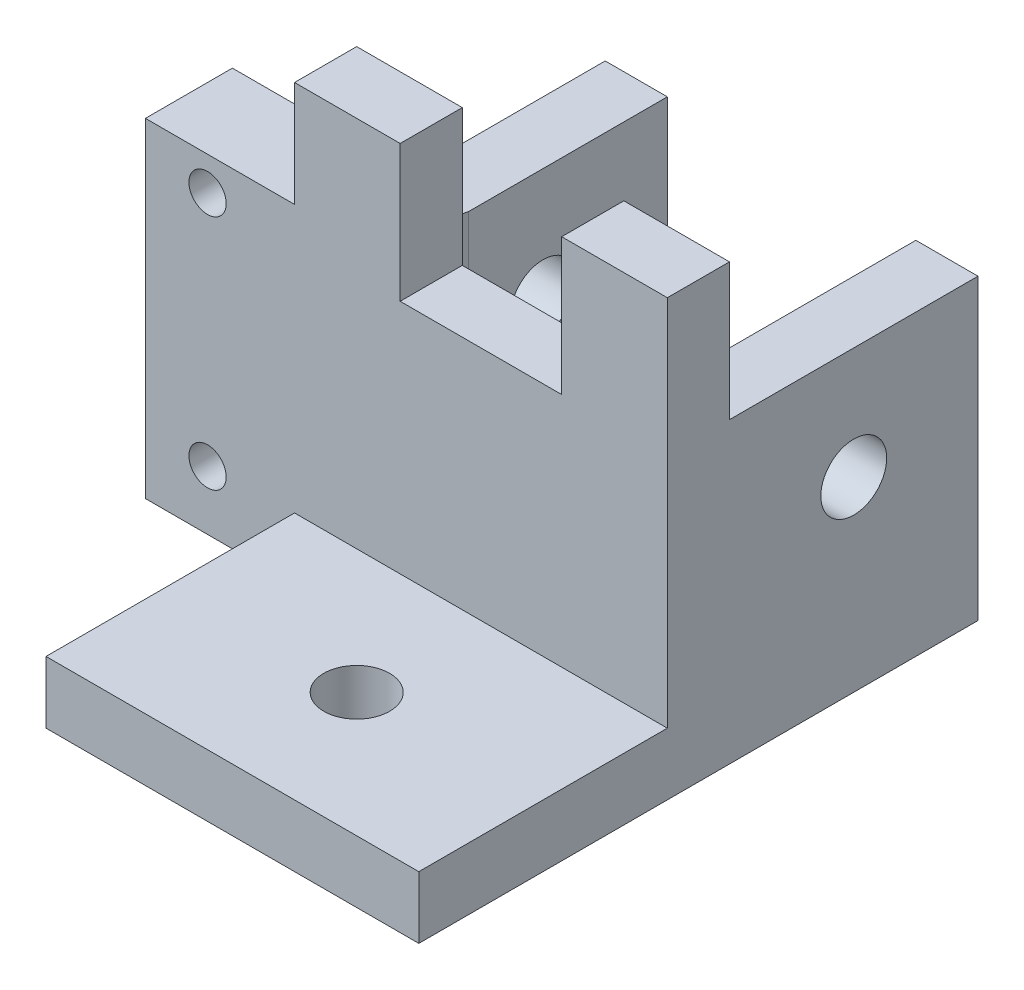
ISO-10303-21;
HEADER;
FILE_DESCRIPTION(('STEP AP214'),'2;1');
FILE_NAME('part.step','',(''),(''),'','','');
FILE_SCHEMA(('AUTOMOTIVE_DESIGN { 1 0 10303 214 1 1 1 1 }'));
ENDSEC;
DATA;
#1=APPLICATION_CONTEXT('core data for automotive mechanical design processes');
#2=APPLICATION_PROTOCOL_DEFINITION('international standard','automotive_design',2000,#1);
#3=PRODUCT_CONTEXT('',#1,'mechanical');
#4=PRODUCT('Part','Part','',(#3));
#5=PRODUCT_RELATED_PRODUCT_CATEGORY('part','',(#4));
#6=PRODUCT_DEFINITION_FORMATION('','',#4);
#7=PRODUCT_DEFINITION_CONTEXT('part definition',#1,'design');
#8=PRODUCT_DEFINITION('design','',#6,#7);
#9=PRODUCT_DEFINITION_SHAPE('','',#8);
#10=(LENGTH_UNIT() NAMED_UNIT(*) SI_UNIT(.MILLI.,.METRE.));
#11=(NAMED_UNIT(*) PLANE_ANGLE_UNIT() SI_UNIT($,.RADIAN.));
#12=(NAMED_UNIT(*) SI_UNIT($,.STERADIAN.) SOLID_ANGLE_UNIT());
#13=UNCERTAINTY_MEASURE_WITH_UNIT(LENGTH_MEASURE(1.E-05),#10,'distance_accuracy_value','');
#14=(GEOMETRIC_REPRESENTATION_CONTEXT(3) GLOBAL_UNCERTAINTY_ASSIGNED_CONTEXT((#13)) GLOBAL_UNIT_ASSIGNED_CONTEXT((#10,
#11,#12)) REPRESENTATION_CONTEXT('',''));
#15=CARTESIAN_POINT('',(0.,0.,0.));
#16=DIRECTION('',(0.,0.,1.));
#17=DIRECTION('',(1.,0.,0.));
#18=AXIS2_PLACEMENT_3D('',#15,#16,#17);
#19=CARTESIAN_POINT('',(0.,5.,0.));
#20=DIRECTION('',(1.,0.,0.));
#21=DIRECTION('',(0.,0.,-1.));
#22=AXIS2_PLACEMENT_3D('',#19,#20,#21);
#23=PLANE('',#22);
#24=CARTESIAN_POINT('',(0.,15.,-35.));
#25=DIRECTION('',(1.,0.,0.));
#26=DIRECTION('',(0.,0.,-1.));
#27=AXIS2_PLACEMENT_3D('',#24,#25,#26);
#28=CIRCLE('',#27,2.65);
#29=CARTESIAN_POINT('',(0.,15.,-37.65));
#30=VERTEX_POINT('',#29);
#31=EDGE_CURVE('E341',#30,#30,#28,.T.);
#32=ORIENTED_EDGE('',*,*,#31,.T.);
#33=EDGE_LOOP('',(#32));
#34=FACE_BOUND('',#33,.T.);
#35=DIRECTION('',(0.,-1.,0.));
#36=VECTOR('',#35,1.);
#37=CARTESIAN_POINT('',(0.,26.5,-25.));
#38=LINE('',#37,#36);
#39=CARTESIAN_POINT('',(0.,19.5,-25.));
#40=VERTEX_POINT('',#39);
#41=CARTESIAN_POINT('',(0.,9.,-25.));
#42=VERTEX_POINT('',#41);
#43=EDGE_CURVE('E294',#40,#42,#38,.T.);
#44=ORIENTED_EDGE('',*,*,#43,.F.);
#45=DIRECTION('',(0.,-0.707106781186544,0.707106781186551));
#46=VECTOR('',#45,1.);
#47=CARTESIAN_POINT('',(0.,-0.249999999999936,-5.24999999999989));
#48=LINE('',#47,#46);
#49=CARTESIAN_POINT('',(0.,21.5,-27.));
#50=VERTEX_POINT('',#49);
#51=EDGE_CURVE('E550',#40,#50,#48,.F.);
#52=ORIENTED_EDGE('',*,*,#51,.T.);
#53=DIRECTION('',(0.,-1.,0.));
#54=VECTOR('',#53,1.);
#55=CARTESIAN_POINT('',(0.,26.5,-27.));
#56=LINE('',#55,#54);
#57=CARTESIAN_POINT('',(0.,24.,-27.));
#58=VERTEX_POINT('',#57);
#59=EDGE_CURVE('E254',#58,#50,#56,.T.);
#60=ORIENTED_EDGE('',*,*,#59,.F.);
#61=DIRECTION('',(0.,0.,1.));
#62=VECTOR('',#61,1.);
#63=CARTESIAN_POINT('',(0.,24.,-25.));
#64=LINE('',#63,#62);
#65=CARTESIAN_POINT('',(0.,24.,-45.));
#66=VERTEX_POINT('',#65);
#67=EDGE_CURVE('E434',#66,#58,#64,.T.);
#68=ORIENTED_EDGE('',*,*,#67,.F.);
#69=DIRECTION('',(0.,-1.,0.));
#70=VECTOR('',#69,1.);
#71=CARTESIAN_POINT('',(0.,5.,-45.));
#72=LINE('',#71,#70);
#73=CARTESIAN_POINT('',(0.,0.,-45.));
#74=VERTEX_POINT('',#73);
#75=EDGE_CURVE('E507',#66,#74,#72,.T.);
#76=ORIENTED_EDGE('',*,*,#75,.T.);
#77=DIRECTION('',(0.,0.,1.));
#78=VECTOR('',#77,1.);
#79=CARTESIAN_POINT('',(0.,0.,0.));
#80=LINE('',#79,#78);
#81=CARTESIAN_POINT('',(0.,0.,-27.));
#82=VERTEX_POINT('',#81);
#83=EDGE_CURVE('E508',#74,#82,#80,.T.);
#84=ORIENTED_EDGE('',*,*,#83,.T.);
#85=DIRECTION('',(0.,-1.,0.));
#86=VECTOR('',#85,1.);
#87=CARTESIAN_POINT('',(0.,0.,-27.));
#88=LINE('',#87,#86);
#89=CARTESIAN_POINT('',(0.,7.,-27.));
#90=VERTEX_POINT('',#89);
#91=EDGE_CURVE('E275',#90,#82,#88,.T.);
#92=ORIENTED_EDGE('',*,*,#91,.F.);
#93=DIRECTION('',(0.,0.707106781186546,0.707106781186549));
#94=VECTOR('',#93,1.);
#95=CARTESIAN_POINT('',(0.,19.5,-14.5));
#96=LINE('',#95,#94);
#97=EDGE_CURVE('E11',#90,#42,#96,.T.);
#98=ORIENTED_EDGE('',*,*,#97,.T.);
#99=EDGE_LOOP('',(#44,#52,#60,#68,#76,#84,#92,#98));
#100=FACE_BOUND('',#99,.T.);
#101=ADVANCED_FACE('F41',(#34,#100),#23,.F.);
#102=CARTESIAN_POINT('',(0.,35.,-25.));
#103=DIRECTION('',(0.,0.,1.));
#104=DIRECTION('',(1.,0.,0.));
#105=AXIS2_PLACEMENT_3D('',#102,#103,#104);
#106=PLANE('',#105);
#107=DIRECTION('',(0.,-1.,0.));
#108=VECTOR('',#107,1.);
#109=CARTESIAN_POINT('',(0.,26.5,-25.));
#110=LINE('',#109,#108);
#111=CARTESIAN_POINT('',(0.,26.5,-25.));
#112=VERTEX_POINT('',#111);
#113=CARTESIAN_POINT('',(0.,24.,-25.));
#114=VERTEX_POINT('',#113);
#115=EDGE_CURVE('E262',#112,#114,#110,.T.);
#116=ORIENTED_EDGE('',*,*,#115,.F.);
#117=DIRECTION('',(0.,-1.,0.));
#118=VECTOR('',#117,1.);
#119=CARTESIAN_POINT('',(0.,35.,-25.));
#120=LINE('',#119,#118);
#121=CARTESIAN_POINT('',(0.,35.,-25.));
#122=VERTEX_POINT('',#121);
#123=EDGE_CURVE('E472',#122,#112,#120,.T.);
#124=ORIENTED_EDGE('',*,*,#123,.F.);
#125=DIRECTION('',(-1.,0.,0.));
#126=VECTOR('',#125,1.);
#127=CARTESIAN_POINT('',(0.,35.,-25.));
#128=LINE('',#127,#126);
#129=CARTESIAN_POINT('',(8.49999999999999,35.,-25.));
#130=VERTEX_POINT('',#129);
#131=EDGE_CURVE('E467',#130,#122,#128,.T.);
#132=ORIENTED_EDGE('',*,*,#131,.F.);
#133=DIRECTION('',(0.,1.,0.));
#134=VECTOR('',#133,1.);
#135=CARTESIAN_POINT('',(8.49999999999999,24.,-25.));
#136=LINE('',#135,#134);
#137=CARTESIAN_POINT('',(8.49999999999999,24.,-25.));
#138=VERTEX_POINT('',#137);
#139=EDGE_CURVE('E402',#138,#130,#136,.T.);
#140=ORIENTED_EDGE('',*,*,#139,.F.);
#141=DIRECTION('',(-1.,0.,0.));
#142=VECTOR('',#141,1.);
#143=CARTESIAN_POINT('',(8.49999999999999,24.,-25.));
#144=LINE('',#143,#142);
#145=CARTESIAN_POINT('',(21.5,24.,-25.));
#146=VERTEX_POINT('',#145);
#147=EDGE_CURVE('E393',#146,#138,#144,.T.);
#148=ORIENTED_EDGE('',*,*,#147,.F.);
#149=DIRECTION('',(0.,1.,0.));
#150=VECTOR('',#149,1.);
#151=CARTESIAN_POINT('',(21.5,24.,-25.));
#152=LINE('',#151,#150);
#153=CARTESIAN_POINT('',(21.5,35.,-25.));
#154=VERTEX_POINT('',#153);
#155=EDGE_CURVE('E406',#146,#154,#152,.T.);
#156=ORIENTED_EDGE('',*,*,#155,.T.);
#157=CARTESIAN_POINT('',(30.,35.,-25.));
#158=VERTEX_POINT('',#157);
#159=EDGE_CURVE('E468',#158,#154,#128,.T.);
#160=ORIENTED_EDGE('',*,*,#159,.F.);
#161=DIRECTION('',(0.,-1.,0.));
#162=VECTOR('',#161,1.);
#163=CARTESIAN_POINT('',(30.,35.,-25.));
#164=LINE('',#163,#162);
#165=CARTESIAN_POINT('',(30.,24.,-25.));
#166=VERTEX_POINT('',#165);
#167=EDGE_CURVE('E481',#158,#166,#164,.T.);
#168=ORIENTED_EDGE('',*,*,#167,.T.);
#169=DIRECTION('',(1.,0.,0.));
#170=VECTOR('',#169,1.);
#171=CARTESIAN_POINT('',(25.,24.,-25.));
#172=LINE('',#171,#170);
#173=CARTESIAN_POINT('',(26.,24.,-25.));
#174=VERTEX_POINT('',#173);
#175=EDGE_CURVE('E419',#174,#166,#172,.T.);
#176=ORIENTED_EDGE('',*,*,#175,.F.);
#177=DIRECTION('',(0.,1.,0.));
#178=VECTOR('',#177,1.);
#179=CARTESIAN_POINT('',(26.,0.876894374382341,-25.));
#180=LINE('',#179,#178);
#181=CARTESIAN_POINT('',(26.,5.,-25.));
#182=VERTEX_POINT('',#181);
#183=EDGE_CURVE('E312',#182,#174,#180,.T.);
#184=ORIENTED_EDGE('',*,*,#183,.F.);
#185=DIRECTION('',(-1.,0.,0.));
#186=VECTOR('',#185,1.);
#187=CARTESIAN_POINT('',(0.,5.,-25.));
#188=LINE('',#187,#186);
#189=CARTESIAN_POINT('',(3.99999999999999,5.,-25.));
#190=VERTEX_POINT('',#189);
#191=EDGE_CURVE('E459',#182,#190,#188,.T.);
#192=ORIENTED_EDGE('',*,*,#191,.T.);
#193=DIRECTION('',(0.,1.,0.));
#194=VECTOR('',#193,1.);
#195=CARTESIAN_POINT('',(3.99999999999999,0.876894374382341,-25.));
#196=LINE('',#195,#194);
#197=CARTESIAN_POINT('',(3.99999999999999,24.,-25.));
#198=VERTEX_POINT('',#197);
#199=EDGE_CURVE('E313',#190,#198,#196,.T.);
#200=ORIENTED_EDGE('',*,*,#199,.T.);
#201=DIRECTION('',(1.,0.,0.));
#202=VECTOR('',#201,1.);
#203=CARTESIAN_POINT('',(0.,24.,-25.));
#204=LINE('',#203,#202);
#205=EDGE_CURVE('E438',#114,#198,#204,.T.);
#206=ORIENTED_EDGE('',*,*,#205,.F.);
#207=EDGE_LOOP('',(#116,#124,#132,#140,#148,#156,#160,#168,#176,#184,#192,#200,#206));
#208=FACE_BOUND('',#207,.T.);
#209=ADVANCED_FACE('F569',(#208),#106,.F.);
#210=DIRECTION('',(-1.,0.,0.));
#211=VECTOR('',#210,1.);
#212=CARTESIAN_POINT('',(-12.,19.5,-25.));
#213=LINE('',#212,#211);
#214=CARTESIAN_POINT('',(-12.,19.5,-25.));
#215=VERTEX_POINT('',#214);
#216=EDGE_CURVE('E237',#40,#215,#213,.T.);
#217=ORIENTED_EDGE('',*,*,#216,.F.);
#218=ORIENTED_EDGE('',*,*,#43,.T.);
#219=DIRECTION('',(1.,0.,0.));
#220=VECTOR('',#219,1.);
#221=CARTESIAN_POINT('',(-12.,9.,-25.));
#222=LINE('',#221,#220);
#223=CARTESIAN_POINT('',(-12.,9.,-25.));
#224=VERTEX_POINT('',#223);
#225=EDGE_CURVE('E271',#224,#42,#222,.T.);
#226=ORIENTED_EDGE('',*,*,#225,.F.);
#227=DIRECTION('',(0.,-1.,0.));
#228=VECTOR('',#227,1.);
#229=CARTESIAN_POINT('',(-12.,26.5,-25.));
#230=LINE('',#229,#228);
#231=EDGE_CURVE('E285',#215,#224,#230,.T.);
#232=ORIENTED_EDGE('',*,*,#231,.F.);
#233=EDGE_LOOP('',(#217,#218,#226,#232));
#234=FACE_BOUND('',#233,.T.);
#235=ADVANCED_FACE('F596',(#234),#106,.F.);
#236=DIRECTION('',(0.,0.,-1.));
#237=VECTOR('',#236,1.);
#238=CARTESIAN_POINT('',(0.,26.5,-25.));
#239=LINE('',#238,#237);
#240=CARTESIAN_POINT('',(0.,26.5,-20.));
#241=VERTEX_POINT('',#240);
#242=EDGE_CURVE('E289',#241,#112,#239,.T.);
#243=ORIENTED_EDGE('',*,*,#242,.F.);
#244=DIRECTION('',(0.,-1.,0.));
#245=VECTOR('',#244,1.);
#246=CARTESIAN_POINT('',(0.,35.,-20.));
#247=LINE('',#246,#245);
#248=CARTESIAN_POINT('',(0.,35.,-20.));
#249=VERTEX_POINT('',#248);
#250=EDGE_CURVE('E489',#249,#241,#247,.T.);
#251=ORIENTED_EDGE('',*,*,#250,.F.);
#252=DIRECTION('',(0.,0.,1.));
#253=VECTOR('',#252,1.);
#254=CARTESIAN_POINT('',(0.,35.,-25.));
#255=LINE('',#254,#253);
#256=EDGE_CURVE('E454',#122,#249,#255,.T.);
#257=ORIENTED_EDGE('',*,*,#256,.F.);
#258=ORIENTED_EDGE('',*,*,#123,.T.);
#259=EDGE_LOOP('',(#243,#251,#257,#258));
#260=FACE_BOUND('',#259,.T.);
#261=ADVANCED_FACE('F615',(#260),#23,.F.);
#262=DIRECTION('',(0.,1.,0.));
#263=VECTOR('',#262,1.);
#264=CARTESIAN_POINT('',(0.,26.5,-20.));
#265=LINE('',#264,#263);
#266=CARTESIAN_POINT('',(0.,0.,-20.));
#267=VERTEX_POINT('',#266);
#268=CARTESIAN_POINT('',(0.,5.,-20.));
#269=VERTEX_POINT('',#268);
#270=EDGE_CURVE('E282',#267,#269,#265,.T.);
#271=ORIENTED_EDGE('',*,*,#270,.F.);
#272=CARTESIAN_POINT('',(0.,0.,0.));
#273=VERTEX_POINT('',#272);
#274=EDGE_CURVE('E493',#267,#273,#80,.T.);
#275=ORIENTED_EDGE('',*,*,#274,.T.);
#276=DIRECTION('',(0.,-1.,0.));
#277=VECTOR('',#276,1.);
#278=CARTESIAN_POINT('',(0.,5.,0.));
#279=LINE('',#278,#277);
#280=CARTESIAN_POINT('',(0.,5.,0.));
#281=VERTEX_POINT('',#280);
#282=EDGE_CURVE('E531',#281,#273,#279,.T.);
#283=ORIENTED_EDGE('',*,*,#282,.F.);
#284=DIRECTION('',(0.,0.,1.));
#285=VECTOR('',#284,1.);
#286=CARTESIAN_POINT('',(0.,5.,0.));
#287=LINE('',#286,#285);
#288=EDGE_CURVE('E494',#269,#281,#287,.T.);
#289=ORIENTED_EDGE('',*,*,#288,.F.);
#290=EDGE_LOOP('',(#271,#275,#283,#289));
#291=FACE_BOUND('',#290,.T.);
#292=ADVANCED_FACE('F675',(#291),#23,.F.);
#293=CARTESIAN_POINT('',(0.,35.,0.));
#294=DIRECTION('',(0.,1.,0.));
#295=DIRECTION('',(0.,0.,1.));
#296=AXIS2_PLACEMENT_3D('',#293,#294,#295);
#297=PLANE('',#296);
#298=DIRECTION('',(0.,0.,1.));
#299=VECTOR('',#298,1.);
#300=CARTESIAN_POINT('',(8.49999999999999,35.,-20.));
#301=LINE('',#300,#299);
#302=CARTESIAN_POINT('',(8.49999999999999,35.,-20.));
#303=VERTEX_POINT('',#302);
#304=EDGE_CURVE('E379',#130,#303,#301,.T.);
#305=ORIENTED_EDGE('',*,*,#304,.F.);
#306=ORIENTED_EDGE('',*,*,#131,.T.);
#307=ORIENTED_EDGE('',*,*,#256,.T.);
#308=DIRECTION('',(1.,0.,0.));
#309=VECTOR('',#308,1.);
#310=CARTESIAN_POINT('',(0.,35.,-20.));
#311=LINE('',#310,#309);
#312=EDGE_CURVE('E460',#249,#303,#311,.T.);
#313=ORIENTED_EDGE('',*,*,#312,.T.);
#314=EDGE_LOOP('',(#305,#306,#307,#313));
#315=FACE_BOUND('',#314,.T.);
#316=ADVANCED_FACE('F622',(#315),#297,.T.);
#317=CARTESIAN_POINT('',(0.,5.,0.));
#318=DIRECTION('',(0.,-1.,0.));
#319=DIRECTION('',(0.,0.,-1.));
#320=AXIS2_PLACEMENT_3D('',#317,#318,#319);
#321=PLANE('',#320);
#322=ORIENTED_EDGE('',*,*,#191,.F.);
#323=DIRECTION('',(0.,0.,-1.));
#324=VECTOR('',#323,1.);
#325=CARTESIAN_POINT('',(26.,5.,-20.8768943743823));
#326=LINE('',#325,#324);
#327=CARTESIAN_POINT('',(26.,5.,-45.));
#328=VERTEX_POINT('',#327);
#329=EDGE_CURVE('E333',#182,#328,#326,.T.);
#330=ORIENTED_EDGE('',*,*,#329,.T.);
#331=DIRECTION('',(-1.,0.,0.));
#332=VECTOR('',#331,1.);
#333=CARTESIAN_POINT('',(0.,5.,-45.));
#334=LINE('',#333,#332);
#335=CARTESIAN_POINT('',(3.99999999999999,5.,-45.));
#336=VERTEX_POINT('',#335);
#337=EDGE_CURVE('E504',#328,#336,#334,.T.);
#338=ORIENTED_EDGE('',*,*,#337,.T.);
#339=DIRECTION('',(0.,0.,-1.));
#340=VECTOR('',#339,1.);
#341=CARTESIAN_POINT('',(3.99999999999999,5.,-20.8768943743823));
#342=LINE('',#341,#340);
#343=EDGE_CURVE('E345',#190,#336,#342,.T.);
#344=ORIENTED_EDGE('',*,*,#343,.F.);
#345=EDGE_LOOP('',(#322,#330,#338,#344));
#346=FACE_BOUND('',#345,.T.);
#347=CARTESIAN_POINT('',(15.,5.,-35.));
#348=DIRECTION('',(0.,-1.,0.));
#349=DIRECTION('',(0.,0.,-1.));
#350=AXIS2_PLACEMENT_3D('',#347,#348,#349);
#351=CIRCLE('',#350,2.65);
#352=CARTESIAN_POINT('',(15.,5.,-37.65));
#353=VERTEX_POINT('',#352);
#354=EDGE_CURVE('E368',#353,#353,#351,.T.);
#355=ORIENTED_EDGE('',*,*,#354,.T.);
#356=EDGE_LOOP('',(#355));
#357=FACE_BOUND('',#356,.T.);
#358=ADVANCED_FACE('F658',(#346,#357),#321,.F.);
#359=CARTESIAN_POINT('',(15.,5.,-10.));
#360=DIRECTION('',(0.,-1.,0.));
#361=DIRECTION('',(0.,0.,-1.));
#362=AXIS2_PLACEMENT_3D('',#359,#360,#361);
#363=CIRCLE('',#362,2.65);
#364=CARTESIAN_POINT('',(15.,5.,-12.65));
#365=VERTEX_POINT('',#364);
#366=EDGE_CURVE('E375',#365,#365,#363,.T.);
#367=ORIENTED_EDGE('',*,*,#366,.T.);
#368=EDGE_LOOP('',(#367));
#369=FACE_BOUND('',#368,.T.);
#370=DIRECTION('',(1.,0.,0.));
#371=VECTOR('',#370,1.);
#372=CARTESIAN_POINT('',(0.,5.,-20.));
#373=LINE('',#372,#371);
#374=CARTESIAN_POINT('',(30.,5.,-20.));
#375=VERTEX_POINT('',#374);
#376=EDGE_CURVE('E453',#269,#375,#373,.T.);
#377=ORIENTED_EDGE('',*,*,#376,.F.);
#378=ORIENTED_EDGE('',*,*,#288,.T.);
#379=DIRECTION('',(1.,0.,0.));
#380=VECTOR('',#379,1.);
#381=CARTESIAN_POINT('',(0.,5.,0.));
#382=LINE('',#381,#380);
#383=CARTESIAN_POINT('',(30.,5.,0.));
#384=VERTEX_POINT('',#383);
#385=EDGE_CURVE('E497',#281,#384,#382,.T.);
#386=ORIENTED_EDGE('',*,*,#385,.T.);
#387=DIRECTION('',(0.,0.,-1.));
#388=VECTOR('',#387,1.);
#389=CARTESIAN_POINT('',(30.,5.,0.));
#390=LINE('',#389,#388);
#391=EDGE_CURVE('E501',#384,#375,#390,.T.);
#392=ORIENTED_EDGE('',*,*,#391,.T.);
#393=EDGE_LOOP('',(#377,#378,#386,#392));
#394=FACE_BOUND('',#393,.T.);
#395=ADVANCED_FACE('F692',(#369,#394),#321,.F.);
#396=CARTESIAN_POINT('',(0.,5.,0.));
#397=DIRECTION('',(0.,0.,-1.));
#398=DIRECTION('',(-1.,0.,0.));
#399=AXIS2_PLACEMENT_3D('',#396,#397,#398);
#400=PLANE('',#399);
#401=DIRECTION('',(1.,0.,0.));
#402=VECTOR('',#401,1.);
#403=CARTESIAN_POINT('',(0.,0.,0.));
#404=LINE('',#403,#402);
#405=CARTESIAN_POINT('',(30.,0.,0.));
#406=VERTEX_POINT('',#405);
#407=EDGE_CURVE('E512',#273,#406,#404,.T.);
#408=ORIENTED_EDGE('',*,*,#407,.T.);
#409=DIRECTION('',(0.,-1.,0.));
#410=VECTOR('',#409,1.);
#411=CARTESIAN_POINT('',(30.,5.,0.));
#412=LINE('',#411,#410);
#413=EDGE_CURVE('E527',#384,#406,#412,.T.);
#414=ORIENTED_EDGE('',*,*,#413,.F.);
#415=ORIENTED_EDGE('',*,*,#385,.F.);
#416=ORIENTED_EDGE('',*,*,#282,.T.);
#417=EDGE_LOOP('',(#408,#414,#415,#416));
#418=FACE_BOUND('',#417,.T.);
#419=ADVANCED_FACE('F697',(#418),#400,.F.);
#420=CARTESIAN_POINT('',(30.,5.,0.));
#421=DIRECTION('',(-1.,0.,0.));
#422=DIRECTION('',(0.,0.,1.));
#423=AXIS2_PLACEMENT_3D('',#420,#421,#422);
#424=PLANE('',#423);
#425=CARTESIAN_POINT('',(30.,15.,-35.));
#426=DIRECTION('',(-1.,0.,0.));
#427=DIRECTION('',(0.,0.,1.));
#428=AXIS2_PLACEMENT_3D('',#425,#426,#427);
#429=CIRCLE('',#428,2.65);
#430=CARTESIAN_POINT('',(30.,15.,-32.35));
#431=VERTEX_POINT('',#430);
#432=EDGE_CURVE('E359',#431,#431,#429,.T.);
#433=ORIENTED_EDGE('',*,*,#432,.T.);
#434=EDGE_LOOP('',(#433));
#435=FACE_BOUND('',#434,.T.);
#436=DIRECTION('',(0.,0.,-1.));
#437=VECTOR('',#436,1.);
#438=CARTESIAN_POINT('',(30.,0.,0.));
#439=LINE('',#438,#437);
#440=CARTESIAN_POINT('',(30.,0.,-45.));
#441=VERTEX_POINT('',#440);
#442=EDGE_CURVE('E515',#406,#441,#439,.T.);
#443=ORIENTED_EDGE('',*,*,#442,.T.);
#444=DIRECTION('',(0.,-1.,0.));
#445=VECTOR('',#444,1.);
#446=CARTESIAN_POINT('',(30.,5.,-45.));
#447=LINE('',#446,#445);
#448=CARTESIAN_POINT('',(30.,24.,-45.));
#449=VERTEX_POINT('',#448);
#450=EDGE_CURVE('E523',#449,#441,#447,.T.);
#451=ORIENTED_EDGE('',*,*,#450,.F.);
#452=DIRECTION('',(0.,0.,-1.));
#453=VECTOR('',#452,1.);
#454=CARTESIAN_POINT('',(30.,24.,-45.));
#455=LINE('',#454,#453);
#456=EDGE_CURVE('E422',#166,#449,#455,.T.);
#457=ORIENTED_EDGE('',*,*,#456,.F.);
#458=ORIENTED_EDGE('',*,*,#167,.F.);
#459=DIRECTION('',(0.,0.,-1.));
#460=VECTOR('',#459,1.);
#461=CARTESIAN_POINT('',(30.,35.,-25.));
#462=LINE('',#461,#460);
#463=CARTESIAN_POINT('',(30.,35.,-20.));
#464=VERTEX_POINT('',#463);
#465=EDGE_CURVE('E464',#464,#158,#462,.T.);
#466=ORIENTED_EDGE('',*,*,#465,.F.);
#467=DIRECTION('',(0.,-1.,0.));
#468=VECTOR('',#467,1.);
#469=CARTESIAN_POINT('',(30.,35.,-20.));
#470=LINE('',#469,#468);
#471=EDGE_CURVE('E485',#464,#375,#470,.T.);
#472=ORIENTED_EDGE('',*,*,#471,.T.);
#473=ORIENTED_EDGE('',*,*,#391,.F.);
#474=ORIENTED_EDGE('',*,*,#413,.T.);
#475=EDGE_LOOP('',(#443,#451,#457,#458,#466,#472,#473,#474));
#476=FACE_BOUND('',#475,.T.);
#477=ADVANCED_FACE('F639',(#435,#476),#424,.F.);
#478=CARTESIAN_POINT('',(0.,5.,-45.));
#479=DIRECTION('',(0.,0.,1.));
#480=DIRECTION('',(1.,0.,0.));
#481=AXIS2_PLACEMENT_3D('',#478,#479,#480);
#482=PLANE('',#481);
#483=ORIENTED_EDGE('',*,*,#337,.F.);
#484=DIRECTION('',(0.242535625036333,-0.970142500145332,0.));
#485=VECTOR('',#484,1.);
#486=CARTESIAN_POINT('',(26.,5.,-45.));
#487=LINE('',#486,#485);
#488=CARTESIAN_POINT('',(25.,9.,-45.));
#489=VERTEX_POINT('',#488);
#490=EDGE_CURVE('E329',#489,#328,#487,.T.);
#491=ORIENTED_EDGE('',*,*,#490,.F.);
#492=DIRECTION('',(0.,-1.,0.));
#493=VECTOR('',#492,1.);
#494=CARTESIAN_POINT('',(25.,24.,-45.));
#495=LINE('',#494,#493);
#496=CARTESIAN_POINT('',(25.,24.,-45.));
#497=VERTEX_POINT('',#496);
#498=EDGE_CURVE('E429',#497,#489,#495,.T.);
#499=ORIENTED_EDGE('',*,*,#498,.F.);
#500=DIRECTION('',(-1.,0.,0.));
#501=VECTOR('',#500,1.);
#502=CARTESIAN_POINT('',(25.,24.,-45.));
#503=LINE('',#502,#501);
#504=EDGE_CURVE('E426',#449,#497,#503,.T.);
#505=ORIENTED_EDGE('',*,*,#504,.F.);
#506=ORIENTED_EDGE('',*,*,#450,.T.);
#507=DIRECTION('',(-1.,0.,0.));
#508=VECTOR('',#507,1.);
#509=CARTESIAN_POINT('',(0.,0.,-45.));
#510=LINE('',#509,#508);
#511=EDGE_CURVE('E498',#441,#74,#510,.T.);
#512=ORIENTED_EDGE('',*,*,#511,.T.);
#513=ORIENTED_EDGE('',*,*,#75,.F.);
#514=DIRECTION('',(-1.,0.,0.));
#515=VECTOR('',#514,1.);
#516=CARTESIAN_POINT('',(0.,24.,-45.));
#517=LINE('',#516,#515);
#518=CARTESIAN_POINT('',(4.99999999999999,24.,-45.));
#519=VERTEX_POINT('',#518);
#520=EDGE_CURVE('E445',#519,#66,#517,.T.);
#521=ORIENTED_EDGE('',*,*,#520,.F.);
#522=DIRECTION('',(0.,-1.,0.));
#523=VECTOR('',#522,1.);
#524=CARTESIAN_POINT('',(4.99999999999999,24.,-45.));
#525=LINE('',#524,#523);
#526=CARTESIAN_POINT('',(4.99999999999999,9.,-45.));
#527=VERTEX_POINT('',#526);
#528=EDGE_CURVE('E449',#519,#527,#525,.T.);
#529=ORIENTED_EDGE('',*,*,#528,.T.);
#530=DIRECTION('',(0.242535625036333,0.970142500145332,0.));
#531=VECTOR('',#530,1.);
#532=CARTESIAN_POINT('',(3.99999999999999,5.,-45.));
#533=LINE('',#532,#531);
#534=EDGE_CURVE('E318',#336,#527,#533,.T.);
#535=ORIENTED_EDGE('',*,*,#534,.F.);
#536=EDGE_LOOP('',(#483,#491,#499,#505,#506,#512,#513,#521,#529,#535));
#537=FACE_BOUND('',#536,.T.);
#538=ADVANCED_FACE('F585',(#537),#482,.F.);
#539=CARTESIAN_POINT('',(0.,0.,0.));
#540=DIRECTION('',(0.,-1.,0.));
#541=DIRECTION('',(0.,0.,-1.));
#542=AXIS2_PLACEMENT_3D('',#539,#540,#541);
#543=PLANE('',#542);
#544=CARTESIAN_POINT('',(15.,0.,-10.));
#545=DIRECTION('',(0.,-1.,0.));
#546=DIRECTION('',(0.,0.,-1.));
#547=AXIS2_PLACEMENT_3D('',#544,#545,#546);
#548=CIRCLE('',#547,2.65);
#549=CARTESIAN_POINT('',(15.,0.,-12.65));
#550=VERTEX_POINT('',#549);
#551=EDGE_CURVE('E364',#550,#550,#548,.T.);
#552=ORIENTED_EDGE('',*,*,#551,.F.);
#553=EDGE_LOOP('',(#552));
#554=FACE_BOUND('',#553,.T.);
#555=CARTESIAN_POINT('',(15.,0.,-35.));
#556=DIRECTION('',(0.,-1.,0.));
#557=DIRECTION('',(0.,0.,-1.));
#558=AXIS2_PLACEMENT_3D('',#555,#556,#557);
#559=CIRCLE('',#558,2.65);
#560=CARTESIAN_POINT('',(15.,0.,-37.65));
#561=VERTEX_POINT('',#560);
#562=EDGE_CURVE('E363',#561,#561,#559,.T.);
#563=ORIENTED_EDGE('',*,*,#562,.F.);
#564=EDGE_LOOP('',(#563));
#565=FACE_BOUND('',#564,.T.);
#566=ORIENTED_EDGE('',*,*,#83,.F.);
#567=ORIENTED_EDGE('',*,*,#511,.F.);
#568=ORIENTED_EDGE('',*,*,#442,.F.);
#569=ORIENTED_EDGE('',*,*,#407,.F.);
#570=ORIENTED_EDGE('',*,*,#274,.F.);
#571=DIRECTION('',(1.,0.,0.));
#572=VECTOR('',#571,1.);
#573=CARTESIAN_POINT('',(-12.,0.,-20.));
#574=LINE('',#573,#572);
#575=CARTESIAN_POINT('',(-12.,0.,-20.));
#576=VERTEX_POINT('',#575);
#577=EDGE_CURVE('E305',#576,#267,#574,.T.);
#578=ORIENTED_EDGE('',*,*,#577,.F.);
#579=DIRECTION('',(0.,0.,1.));
#580=VECTOR('',#579,1.);
#581=CARTESIAN_POINT('',(-12.,0.,-25.));
#582=LINE('',#581,#580);
#583=CARTESIAN_POINT('',(-12.,0.,-27.));
#584=VERTEX_POINT('',#583);
#585=EDGE_CURVE('E288',#584,#576,#582,.T.);
#586=ORIENTED_EDGE('',*,*,#585,.F.);
#587=DIRECTION('',(-1.,0.,0.));
#588=VECTOR('',#587,1.);
#589=CARTESIAN_POINT('',(-12.,0.,-27.));
#590=LINE('',#589,#588);
#591=EDGE_CURVE('E278',#82,#584,#590,.T.);
#592=ORIENTED_EDGE('',*,*,#591,.F.);
#593=EDGE_LOOP('',(#566,#567,#568,#569,#570,#578,#586,#592));
#594=FACE_BOUND('',#593,.T.);
#595=ADVANCED_FACE('F603',(#554,#565,#594),#543,.T.);
#596=CARTESIAN_POINT('',(0.,35.,-20.));
#597=DIRECTION('',(0.,0.,-1.));
#598=DIRECTION('',(-1.,0.,0.));
#599=AXIS2_PLACEMENT_3D('',#596,#597,#598);
#600=PLANE('',#599);
#601=CARTESIAN_POINT('',(-7.,23.8,-20.));
#602=DIRECTION('',(0.,0.,-1.));
#603=DIRECTION('',(-1.,0.,0.));
#604=AXIS2_PLACEMENT_3D('',#601,#602,#603);
#605=CIRCLE('',#604,1.5);
#606=CARTESIAN_POINT('',(-8.5,23.8,-20.));
#607=VERTEX_POINT('',#606);
#608=EDGE_CURVE('E942',#607,#607,#605,.T.);
#609=ORIENTED_EDGE('',*,*,#608,.T.);
#610=EDGE_LOOP('',(#609));
#611=FACE_BOUND('',#610,.T.);
#612=CARTESIAN_POINT('',(-7.,4.75,-20.));
#613=DIRECTION('',(0.,0.,-1.));
#614=DIRECTION('',(-1.,0.,0.));
#615=AXIS2_PLACEMENT_3D('',#612,#613,#614);
#616=CIRCLE('',#615,1.5);
#617=CARTESIAN_POINT('',(-8.5,4.75,-20.));
#618=VERTEX_POINT('',#617);
#619=EDGE_CURVE('E265',#618,#618,#616,.T.);
#620=ORIENTED_EDGE('',*,*,#619,.T.);
#621=EDGE_LOOP('',(#620));
#622=FACE_BOUND('',#621,.T.);
#623=DIRECTION('',(1.,0.,0.));
#624=VECTOR('',#623,1.);
#625=CARTESIAN_POINT('',(8.49999999999999,24.,-20.));
#626=LINE('',#625,#624);
#627=CARTESIAN_POINT('',(8.49999999999999,24.,-20.));
#628=VERTEX_POINT('',#627);
#629=CARTESIAN_POINT('',(21.5,24.,-20.));
#630=VERTEX_POINT('',#629);
#631=EDGE_CURVE('E384',#628,#630,#626,.T.);
#632=ORIENTED_EDGE('',*,*,#631,.F.);
#633=DIRECTION('',(0.,1.,0.));
#634=VECTOR('',#633,1.);
#635=CARTESIAN_POINT('',(8.49999999999999,24.,-20.));
#636=LINE('',#635,#634);
#637=EDGE_CURVE('E397',#628,#303,#636,.T.);
#638=ORIENTED_EDGE('',*,*,#637,.T.);
#639=ORIENTED_EDGE('',*,*,#312,.F.);
#640=ORIENTED_EDGE('',*,*,#250,.T.);
#641=DIRECTION('',(1.,0.,0.));
#642=VECTOR('',#641,1.);
#643=CARTESIAN_POINT('',(-12.,26.5,-20.));
#644=LINE('',#643,#642);
#645=CARTESIAN_POINT('',(-12.,26.5,-20.));
#646=VERTEX_POINT('',#645);
#647=EDGE_CURVE('E247',#646,#241,#644,.T.);
#648=ORIENTED_EDGE('',*,*,#647,.F.);
#649=DIRECTION('',(0.,1.,0.));
#650=VECTOR('',#649,1.);
#651=CARTESIAN_POINT('',(-12.,26.5,-20.));
#652=LINE('',#651,#650);
#653=EDGE_CURVE('E243',#576,#646,#652,.T.);
#654=ORIENTED_EDGE('',*,*,#653,.F.);
#655=ORIENTED_EDGE('',*,*,#577,.T.);
#656=ORIENTED_EDGE('',*,*,#270,.T.);
#657=ORIENTED_EDGE('',*,*,#376,.T.);
#658=ORIENTED_EDGE('',*,*,#471,.F.);
#659=CARTESIAN_POINT('',(21.5,35.,-20.));
#660=VERTEX_POINT('',#659);
#661=EDGE_CURVE('E458',#660,#464,#311,.T.);
#662=ORIENTED_EDGE('',*,*,#661,.F.);
#663=DIRECTION('',(0.,1.,0.));
#664=VECTOR('',#663,1.);
#665=CARTESIAN_POINT('',(21.5,24.,-20.));
#666=LINE('',#665,#664);
#667=EDGE_CURVE('E410',#630,#660,#666,.T.);
#668=ORIENTED_EDGE('',*,*,#667,.F.);
#669=EDGE_LOOP('',(#632,#638,#639,#640,#648,#654,#655,#656,#657,#658,#662,#668));
#670=FACE_BOUND('',#669,.T.);
#671=ADVANCED_FACE('F611',(#611,#622,#670),#600,.F.);
#672=DIRECTION('',(0.,0.,-1.));
#673=VECTOR('',#672,1.);
#674=CARTESIAN_POINT('',(21.5,35.,-20.));
#675=LINE('',#674,#673);
#676=EDGE_CURVE('E385',#660,#154,#675,.T.);
#677=ORIENTED_EDGE('',*,*,#676,.F.);
#678=ORIENTED_EDGE('',*,*,#661,.T.);
#679=ORIENTED_EDGE('',*,*,#465,.T.);
#680=ORIENTED_EDGE('',*,*,#159,.T.);
#681=EDGE_LOOP('',(#677,#678,#679,#680));
#682=FACE_BOUND('',#681,.T.);
#683=ADVANCED_FACE('F633',(#682),#297,.T.);
#684=CARTESIAN_POINT('',(4.99999999999999,24.,-25.));
#685=DIRECTION('',(-1.,0.,0.));
#686=DIRECTION('',(0.,0.,1.));
#687=AXIS2_PLACEMENT_3D('',#684,#685,#686);
#688=PLANE('',#687);
#689=CARTESIAN_POINT('',(4.99999999999999,15.,-35.));
#690=DIRECTION('',(-1.,0.,0.));
#691=DIRECTION('',(0.,0.,1.));
#692=AXIS2_PLACEMENT_3D('',#689,#690,#691);
#693=CIRCLE('',#692,2.65);
#694=CARTESIAN_POINT('',(4.99999999999999,15.,-32.35));
#695=VERTEX_POINT('',#694);
#696=EDGE_CURVE('E355',#695,#695,#693,.T.);
#697=ORIENTED_EDGE('',*,*,#696,.T.);
#698=EDGE_LOOP('',(#697));
#699=FACE_BOUND('',#698,.T.);
#700=DIRECTION('',(0.,0.,-1.));
#701=VECTOR('',#700,1.);
#702=CARTESIAN_POINT('',(4.99999999999999,24.,-25.));
#703=LINE('',#702,#701);
#704=CARTESIAN_POINT('',(4.99999999999999,24.,-29.));
#705=VERTEX_POINT('',#704);
#706=EDGE_CURVE('E442',#705,#519,#703,.T.);
#707=ORIENTED_EDGE('',*,*,#706,.F.);
#708=DIRECTION('',(0.,1.,0.));
#709=VECTOR('',#708,1.);
#710=CARTESIAN_POINT('',(4.99999999999999,0.876894374382341,-29.));
#711=LINE('',#710,#709);
#712=CARTESIAN_POINT('',(4.99999999999999,9.,-29.));
#713=VERTEX_POINT('',#712);
#714=EDGE_CURVE('E324',#713,#705,#711,.T.);
#715=ORIENTED_EDGE('',*,*,#714,.F.);
#716=DIRECTION('',(0.,0.,-1.));
#717=VECTOR('',#716,1.);
#718=CARTESIAN_POINT('',(4.99999999999999,9.,-20.8768943743823));
#719=LINE('',#718,#717);
#720=EDGE_CURVE('E334',#713,#527,#719,.T.);
#721=ORIENTED_EDGE('',*,*,#720,.T.);
#722=ORIENTED_EDGE('',*,*,#528,.F.);
#723=EDGE_LOOP('',(#707,#715,#721,#722));
#724=FACE_BOUND('',#723,.T.);
#725=ADVANCED_FACE('F580',(#699,#724),#688,.F.);
#726=CARTESIAN_POINT('',(0.,24.,0.));
#727=DIRECTION('',(0.,-1.,0.));
#728=DIRECTION('',(0.,0.,-1.));
#729=AXIS2_PLACEMENT_3D('',#726,#727,#728);
#730=PLANE('',#729);
#731=ORIENTED_EDGE('',*,*,#205,.T.);
#732=DIRECTION('',(-0.242535625036333,0.,0.970142500145332));
#733=VECTOR('',#732,1.);
#734=CARTESIAN_POINT('',(4.99999999999999,24.,-29.));
#735=LINE('',#734,#733);
#736=EDGE_CURVE('E308',#705,#198,#735,.T.);
#737=ORIENTED_EDGE('',*,*,#736,.F.);
#738=ORIENTED_EDGE('',*,*,#706,.T.);
#739=ORIENTED_EDGE('',*,*,#520,.T.);
#740=ORIENTED_EDGE('',*,*,#67,.T.);
#741=EDGE_CURVE('E433',#58,#114,#64,.T.);
#742=ORIENTED_EDGE('',*,*,#741,.T.);
#743=EDGE_LOOP('',(#731,#737,#738,#739,#740,#742));
#744=FACE_BOUND('',#743,.T.);
#745=ADVANCED_FACE('F563',(#744),#730,.F.);
#746=CARTESIAN_POINT('',(25.,24.,-45.));
#747=DIRECTION('',(1.,0.,0.));
#748=DIRECTION('',(0.,0.,-1.));
#749=AXIS2_PLACEMENT_3D('',#746,#747,#748);
#750=PLANE('',#749);
#751=CARTESIAN_POINT('',(25.,15.,-35.));
#752=DIRECTION('',(1.,0.,0.));
#753=DIRECTION('',(0.,0.,-1.));
#754=AXIS2_PLACEMENT_3D('',#751,#752,#753);
#755=CIRCLE('',#754,2.65);
#756=CARTESIAN_POINT('',(25.,15.,-37.65));
#757=VERTEX_POINT('',#756);
#758=EDGE_CURVE('E354',#757,#757,#755,.T.);
#759=ORIENTED_EDGE('',*,*,#758,.T.);
#760=EDGE_LOOP('',(#759));
#761=FACE_BOUND('',#760,.T.);
#762=DIRECTION('',(0.,0.,-1.));
#763=VECTOR('',#762,1.);
#764=CARTESIAN_POINT('',(25.,9.,-20.8768943743823));
#765=LINE('',#764,#763);
#766=CARTESIAN_POINT('',(25.,9.,-29.));
#767=VERTEX_POINT('',#766);
#768=EDGE_CURVE('E338',#767,#489,#765,.T.);
#769=ORIENTED_EDGE('',*,*,#768,.F.);
#770=DIRECTION('',(0.,1.,0.));
#771=VECTOR('',#770,1.);
#772=CARTESIAN_POINT('',(25.,0.876894374382341,-29.));
#773=LINE('',#772,#771);
#774=CARTESIAN_POINT('',(25.,24.,-29.));
#775=VERTEX_POINT('',#774);
#776=EDGE_CURVE('E314',#767,#775,#773,.T.);
#777=ORIENTED_EDGE('',*,*,#776,.T.);
#778=DIRECTION('',(0.,0.,1.));
#779=VECTOR('',#778,1.);
#780=CARTESIAN_POINT('',(25.,24.,-45.));
#781=LINE('',#780,#779);
#782=EDGE_CURVE('E405',#497,#775,#781,.T.);
#783=ORIENTED_EDGE('',*,*,#782,.F.);
#784=ORIENTED_EDGE('',*,*,#498,.T.);
#785=EDGE_LOOP('',(#769,#777,#783,#784));
#786=FACE_BOUND('',#785,.T.);
#787=ADVANCED_FACE('F650',(#761,#786),#750,.F.);
#788=CARTESIAN_POINT('',(0.,24.,0.));
#789=DIRECTION('',(0.,1.,0.));
#790=DIRECTION('',(0.,0.,1.));
#791=AXIS2_PLACEMENT_3D('',#788,#789,#790);
#792=PLANE('',#791);
#793=DIRECTION('',(-0.242535625036333,0.,-0.970142500145332));
#794=VECTOR('',#793,1.);
#795=CARTESIAN_POINT('',(26.,24.,-25.));
#796=LINE('',#795,#794);
#797=EDGE_CURVE('E309',#174,#775,#796,.T.);
#798=ORIENTED_EDGE('',*,*,#797,.F.);
#799=ORIENTED_EDGE('',*,*,#175,.T.);
#800=ORIENTED_EDGE('',*,*,#456,.T.);
#801=ORIENTED_EDGE('',*,*,#504,.T.);
#802=ORIENTED_EDGE('',*,*,#782,.T.);
#803=EDGE_LOOP('',(#798,#799,#800,#801,#802));
#804=FACE_BOUND('',#803,.T.);
#805=ADVANCED_FACE('F643',(#804),#792,.T.);
#806=CARTESIAN_POINT('',(8.49999999999999,24.,-20.));
#807=DIRECTION('',(-1.,0.,0.));
#808=DIRECTION('',(0.,0.,1.));
#809=AXIS2_PLACEMENT_3D('',#806,#807,#808);
#810=PLANE('',#809);
#811=ORIENTED_EDGE('',*,*,#304,.T.);
#812=ORIENTED_EDGE('',*,*,#637,.F.);
#813=DIRECTION('',(0.,0.,1.));
#814=VECTOR('',#813,1.);
#815=CARTESIAN_POINT('',(8.49999999999999,24.,-20.));
#816=LINE('',#815,#814);
#817=EDGE_CURVE('E380',#138,#628,#816,.T.);
#818=ORIENTED_EDGE('',*,*,#817,.F.);
#819=ORIENTED_EDGE('',*,*,#139,.T.);
#820=EDGE_LOOP('',(#811,#812,#818,#819));
#821=FACE_BOUND('',#820,.T.);
#822=ADVANCED_FACE('F624',(#821),#810,.F.);
#823=CARTESIAN_POINT('',(21.5,24.,-20.));
#824=DIRECTION('',(1.,0.,0.));
#825=DIRECTION('',(0.,0.,-1.));
#826=AXIS2_PLACEMENT_3D('',#823,#824,#825);
#827=PLANE('',#826);
#828=ORIENTED_EDGE('',*,*,#676,.T.);
#829=ORIENTED_EDGE('',*,*,#155,.F.);
#830=DIRECTION('',(0.,0.,-1.));
#831=VECTOR('',#830,1.);
#832=CARTESIAN_POINT('',(21.5,24.,-20.));
#833=LINE('',#832,#831);
#834=EDGE_CURVE('E389',#630,#146,#833,.T.);
#835=ORIENTED_EDGE('',*,*,#834,.F.);
#836=ORIENTED_EDGE('',*,*,#667,.T.);
#837=EDGE_LOOP('',(#828,#829,#835,#836));
#838=FACE_BOUND('',#837,.T.);
#839=ADVANCED_FACE('F730',(#838),#827,.F.);
#840=CARTESIAN_POINT('',(0.,24.,0.));
#841=DIRECTION('',(0.,-1.,0.));
#842=DIRECTION('',(0.,0.,-1.));
#843=AXIS2_PLACEMENT_3D('',#840,#841,#842);
#844=PLANE('',#843);
#845=ORIENTED_EDGE('',*,*,#817,.T.);
#846=ORIENTED_EDGE('',*,*,#631,.T.);
#847=ORIENTED_EDGE('',*,*,#834,.T.);
#848=ORIENTED_EDGE('',*,*,#147,.T.);
#849=EDGE_LOOP('',(#845,#846,#847,#848));
#850=FACE_BOUND('',#849,.T.);
#851=ADVANCED_FACE('F628',(#850),#844,.F.);
#852=CARTESIAN_POINT('',(15.,10.,-35.));
#853=DIRECTION('',(0.,-1.,0.));
#854=DIRECTION('',(0.,0.,-1.));
#855=AXIS2_PLACEMENT_3D('',#852,#853,#854);
#856=CYLINDRICAL_SURFACE('',#855,2.65);
#857=ORIENTED_EDGE('',*,*,#562,.T.);
#858=EDGE_LOOP('',(#857));
#859=FACE_BOUND('',#858,.T.);
#860=ORIENTED_EDGE('',*,*,#354,.F.);
#861=EDGE_LOOP('',(#860));
#862=FACE_BOUND('',#861,.T.);
#863=ADVANCED_FACE('F735',(#859,#862),#856,.F.);
#864=CARTESIAN_POINT('',(15.,10.,-10.));
#865=DIRECTION('',(0.,-1.,0.));
#866=DIRECTION('',(0.,0.,-1.));
#867=AXIS2_PLACEMENT_3D('',#864,#865,#866);
#868=CYLINDRICAL_SURFACE('',#867,2.65);
#869=ORIENTED_EDGE('',*,*,#551,.T.);
#870=EDGE_LOOP('',(#869));
#871=FACE_BOUND('',#870,.T.);
#872=ORIENTED_EDGE('',*,*,#366,.F.);
#873=EDGE_LOOP('',(#872));
#874=FACE_BOUND('',#873,.T.);
#875=ADVANCED_FACE('F738',(#871,#874),#868,.F.);
#876=CARTESIAN_POINT('',(0.,15.,-35.));
#877=DIRECTION('',(1.,0.,0.));
#878=DIRECTION('',(0.,0.,-1.));
#879=AXIS2_PLACEMENT_3D('',#876,#877,#878);
#880=CYLINDRICAL_SURFACE('',#879,2.65);
#881=ORIENTED_EDGE('',*,*,#758,.F.);
#882=EDGE_LOOP('',(#881));
#883=FACE_BOUND('',#882,.T.);
#884=ORIENTED_EDGE('',*,*,#432,.F.);
#885=EDGE_LOOP('',(#884));
#886=FACE_BOUND('',#885,.T.);
#887=ADVANCED_FACE('F741',(#883,#886),#880,.F.);
#888=ORIENTED_EDGE('',*,*,#31,.F.);
#889=EDGE_LOOP('',(#888));
#890=FACE_BOUND('',#889,.T.);
#891=ORIENTED_EDGE('',*,*,#696,.F.);
#892=EDGE_LOOP('',(#891));
#893=FACE_BOUND('',#892,.T.);
#894=ADVANCED_FACE('F669',(#890,#893),#880,.F.);
#895=CARTESIAN_POINT('',(26.,5.,-20.8768943743823));
#896=DIRECTION('',(0.970142500145332,0.242535625036333,0.));
#897=DIRECTION('',(-0.242535625036333,0.970142500145332,0.));
#898=AXIS2_PLACEMENT_3D('',#895,#896,#897);
#899=PLANE('',#898);
#900=ORIENTED_EDGE('',*,*,#329,.F.);
#901=DIRECTION('',(-0.174077655955698,0.696310623822791,-0.696310623822791));
#902=VECTOR('',#901,1.);
#903=CARTESIAN_POINT('',(26.4997703788627,3.00091848454901,-23.000918484549));
#904=LINE('',#903,#902);
#905=EDGE_CURVE('E298',#182,#767,#904,.T.);
#906=ORIENTED_EDGE('',*,*,#905,.T.);
#907=ORIENTED_EDGE('',*,*,#768,.T.);
#908=ORIENTED_EDGE('',*,*,#490,.T.);
#909=EDGE_LOOP('',(#900,#906,#907,#908));
#910=FACE_BOUND('',#909,.T.);
#911=ADVANCED_FACE('F655',(#910),#899,.F.);
#912=CARTESIAN_POINT('',(3.99999999999999,5.,-20.8768943743823));
#913=DIRECTION('',(-0.970142500145332,0.242535625036333,0.));
#914=DIRECTION('',(-0.242535625036333,-0.970142500145332,0.));
#915=AXIS2_PLACEMENT_3D('',#912,#913,#914);
#916=PLANE('',#915);
#917=ORIENTED_EDGE('',*,*,#720,.F.);
#918=DIRECTION('',(-0.174077655955698,-0.696310623822792,0.696310623822791));
#919=VECTOR('',#918,1.);
#920=CARTESIAN_POINT('',(3.50022962113725,3.00091848454901,-23.000918484549));
#921=LINE('',#920,#919);
#922=EDGE_CURVE('E535',#713,#190,#921,.T.);
#923=ORIENTED_EDGE('',*,*,#922,.T.);
#924=ORIENTED_EDGE('',*,*,#343,.T.);
#925=ORIENTED_EDGE('',*,*,#534,.T.);
#926=EDGE_LOOP('',(#917,#923,#924,#925));
#927=FACE_BOUND('',#926,.T.);
#928=ADVANCED_FACE('F661',(#927),#916,.F.);
#929=CARTESIAN_POINT('',(4.99999999999999,0.876894374382341,-29.));
#930=DIRECTION('',(-0.970142500145332,0.,-0.242535625036333));
#931=DIRECTION('',(-0.242535625036333,0.,0.970142500145332));
#932=AXIS2_PLACEMENT_3D('',#929,#930,#931);
#933=PLANE('',#932);
#934=ORIENTED_EDGE('',*,*,#714,.T.);
#935=ORIENTED_EDGE('',*,*,#736,.T.);
#936=ORIENTED_EDGE('',*,*,#199,.F.);
#937=ORIENTED_EDGE('',*,*,#922,.F.);
#938=EDGE_LOOP('',(#934,#935,#936,#937));
#939=FACE_BOUND('',#938,.T.);
#940=ADVANCED_FACE('F575',(#939),#933,.F.);
#941=CARTESIAN_POINT('',(26.,0.876894374382341,-25.));
#942=DIRECTION('',(0.970142500145332,0.,-0.242535625036333));
#943=DIRECTION('',(-0.242535625036333,0.,-0.970142500145332));
#944=AXIS2_PLACEMENT_3D('',#941,#942,#943);
#945=PLANE('',#944);
#946=ORIENTED_EDGE('',*,*,#183,.T.);
#947=ORIENTED_EDGE('',*,*,#797,.T.);
#948=ORIENTED_EDGE('',*,*,#776,.F.);
#949=ORIENTED_EDGE('',*,*,#905,.F.);
#950=EDGE_LOOP('',(#946,#947,#948,#949));
#951=FACE_BOUND('',#950,.T.);
#952=ADVANCED_FACE('F647',(#951),#945,.F.);
#953=CARTESIAN_POINT('',(-12.,26.5,-25.));
#954=DIRECTION('',(0.,-1.,0.));
#955=DIRECTION('',(0.,0.,-1.));
#956=AXIS2_PLACEMENT_3D('',#953,#954,#955);
#957=PLANE('',#956);
#958=ORIENTED_EDGE('',*,*,#242,.T.);
#959=DIRECTION('',(0.,0.,1.));
#960=VECTOR('',#959,1.);
#961=CARTESIAN_POINT('',(0.,26.5,-27.));
#962=LINE('',#961,#960);
#963=CARTESIAN_POINT('',(0.,26.5,-27.));
#964=VERTEX_POINT('',#963);
#965=EDGE_CURVE('E251',#964,#112,#962,.T.);
#966=ORIENTED_EDGE('',*,*,#965,.F.);
#967=DIRECTION('',(1.,0.,0.));
#968=VECTOR('',#967,1.);
#969=CARTESIAN_POINT('',(-12.,26.5,-27.));
#970=LINE('',#969,#968);
#971=CARTESIAN_POINT('',(-12.,26.5,-27.));
#972=VERTEX_POINT('',#971);
#973=EDGE_CURVE('E232',#972,#964,#970,.T.);
#974=ORIENTED_EDGE('',*,*,#973,.F.);
#975=DIRECTION('',(0.,0.,-1.));
#976=VECTOR('',#975,1.);
#977=CARTESIAN_POINT('',(-12.,26.5,-25.));
#978=LINE('',#977,#976);
#979=EDGE_CURVE('E240',#646,#972,#978,.T.);
#980=ORIENTED_EDGE('',*,*,#979,.F.);
#981=ORIENTED_EDGE('',*,*,#647,.T.);
#982=EDGE_LOOP('',(#958,#966,#974,#980,#981));
#983=FACE_BOUND('',#982,.T.);
#984=ADVANCED_FACE('F250',(#983),#957,.F.);
#985=CARTESIAN_POINT('',(-12.,0.,0.));
#986=DIRECTION('',(-1.,0.,0.));
#987=DIRECTION('',(0.,0.,1.));
#988=AXIS2_PLACEMENT_3D('',#985,#986,#987);
#989=PLANE('',#988);
#990=ORIENTED_EDGE('',*,*,#231,.T.);
#991=DIRECTION('',(0.,-0.707106781186546,-0.707106781186549));
#992=VECTOR('',#991,1.);
#993=CARTESIAN_POINT('',(-12.,17.,-17.));
#994=LINE('',#993,#992);
#995=CARTESIAN_POINT('',(-12.,7.,-27.));
#996=VERTEX_POINT('',#995);
#997=EDGE_CURVE('E50',#224,#996,#994,.T.);
#998=ORIENTED_EDGE('',*,*,#997,.T.);
#999=DIRECTION('',(0.,1.,0.));
#1000=VECTOR('',#999,1.);
#1001=CARTESIAN_POINT('',(-12.,0.,-27.));
#1002=LINE('',#1001,#1000);
#1003=EDGE_CURVE('E272',#584,#996,#1002,.T.);
#1004=ORIENTED_EDGE('',*,*,#1003,.F.);
#1005=ORIENTED_EDGE('',*,*,#585,.T.);
#1006=ORIENTED_EDGE('',*,*,#653,.T.);
#1007=ORIENTED_EDGE('',*,*,#979,.T.);
#1008=DIRECTION('',(0.,1.,0.));
#1009=VECTOR('',#1008,1.);
#1010=CARTESIAN_POINT('',(-12.,26.5,-27.));
#1011=LINE('',#1010,#1009);
#1012=CARTESIAN_POINT('',(-12.,21.5,-27.));
#1013=VERTEX_POINT('',#1012);
#1014=EDGE_CURVE('E226',#1013,#972,#1011,.T.);
#1015=ORIENTED_EDGE('',*,*,#1014,.F.);
#1016=DIRECTION('',(0.,0.707106781186544,-0.707106781186551));
#1017=VECTOR('',#1016,1.);
#1018=CARTESIAN_POINT('',(-12.,-2.74999999999992,-2.74999999999989));
#1019=LINE('',#1018,#1017);
#1020=EDGE_CURVE('E547',#1013,#215,#1019,.F.);
#1021=ORIENTED_EDGE('',*,*,#1020,.T.);
#1022=EDGE_LOOP('',(#990,#998,#1004,#1005,#1006,#1007,#1015,#1021));
#1023=FACE_BOUND('',#1022,.T.);
#1024=ADVANCED_FACE('F241',(#1023),#989,.T.);
#1025=CARTESIAN_POINT('',(0.,0.,-27.));
#1026=DIRECTION('',(0.,0.,-1.));
#1027=DIRECTION('',(-1.,0.,0.));
#1028=AXIS2_PLACEMENT_3D('',#1025,#1026,#1027);
#1029=PLANE('',#1028);
#1030=CARTESIAN_POINT('',(-7.,4.75,-27.));
#1031=DIRECTION('',(0.,0.,-1.));
#1032=DIRECTION('',(-1.,0.,0.));
#1033=AXIS2_PLACEMENT_3D('',#1030,#1031,#1032);
#1034=CIRCLE('',#1033,1.5);
#1035=CARTESIAN_POINT('',(-8.5,4.75,-27.));
#1036=VERTEX_POINT('',#1035);
#1037=EDGE_CURVE('E937',#1036,#1036,#1034,.T.);
#1038=ORIENTED_EDGE('',*,*,#1037,.F.);
#1039=EDGE_LOOP('',(#1038));
#1040=FACE_BOUND('',#1039,.T.);
#1041=ORIENTED_EDGE('',*,*,#1003,.T.);
#1042=DIRECTION('',(1.,0.,0.));
#1043=VECTOR('',#1042,1.);
#1044=CARTESIAN_POINT('',(0.,7.,-27.));
#1045=LINE('',#1044,#1043);
#1046=EDGE_CURVE('E553',#996,#90,#1045,.T.);
#1047=ORIENTED_EDGE('',*,*,#1046,.T.);
#1048=ORIENTED_EDGE('',*,*,#91,.T.);
#1049=ORIENTED_EDGE('',*,*,#591,.T.);
#1050=EDGE_LOOP('',(#1041,#1047,#1048,#1049));
#1051=FACE_BOUND('',#1050,.T.);
#1052=ADVANCED_FACE('F599',(#1040,#1051),#1029,.T.);
#1053=CARTESIAN_POINT('',(0.,26.5,-27.));
#1054=DIRECTION('',(-1.,0.,0.));
#1055=DIRECTION('',(0.,-1.,0.));
#1056=AXIS2_PLACEMENT_3D('',#1053,#1054,#1055);
#1057=PLANE('',#1056);
#1058=ORIENTED_EDGE('',*,*,#115,.T.);
#1059=ORIENTED_EDGE('',*,*,#741,.F.);
#1060=EDGE_CURVE('E257',#964,#58,#56,.T.);
#1061=ORIENTED_EDGE('',*,*,#1060,.F.);
#1062=ORIENTED_EDGE('',*,*,#965,.T.);
#1063=EDGE_LOOP('',(#1058,#1059,#1061,#1062));
#1064=FACE_BOUND('',#1063,.T.);
#1065=ADVANCED_FACE('F848',(#1064),#1057,.F.);
#1066=CARTESIAN_POINT('',(0.,0.,-27.));
#1067=DIRECTION('',(0.,0.,1.));
#1068=DIRECTION('',(1.,0.,0.));
#1069=AXIS2_PLACEMENT_3D('',#1066,#1067,#1068);
#1070=PLANE('',#1069);
#1071=CARTESIAN_POINT('',(-7.,23.8,-27.));
#1072=DIRECTION('',(0.,0.,-1.));
#1073=DIRECTION('',(-1.,0.,0.));
#1074=AXIS2_PLACEMENT_3D('',#1071,#1072,#1073);
#1075=CIRCLE('',#1074,1.5);
#1076=CARTESIAN_POINT('',(-8.5,23.8,-27.));
#1077=VERTEX_POINT('',#1076);
#1078=EDGE_CURVE('E945',#1077,#1077,#1075,.T.);
#1079=ORIENTED_EDGE('',*,*,#1078,.F.);
#1080=EDGE_LOOP('',(#1079));
#1081=FACE_BOUND('',#1080,.T.);
#1082=ORIENTED_EDGE('',*,*,#59,.T.);
#1083=DIRECTION('',(-1.,0.,0.));
#1084=VECTOR('',#1083,1.);
#1085=CARTESIAN_POINT('',(0.,21.5,-27.));
#1086=LINE('',#1085,#1084);
#1087=EDGE_CURVE('E235',#50,#1013,#1086,.T.);
#1088=ORIENTED_EDGE('',*,*,#1087,.T.);
#1089=ORIENTED_EDGE('',*,*,#1014,.T.);
#1090=ORIENTED_EDGE('',*,*,#973,.T.);
#1091=ORIENTED_EDGE('',*,*,#1060,.T.);
#1092=EDGE_LOOP('',(#1082,#1088,#1089,#1090,#1091));
#1093=FACE_BOUND('',#1092,.T.);
#1094=ADVANCED_FACE('F229',(#1081,#1093),#1070,.F.);
#1095=CARTESIAN_POINT('',(0.,21.5,-27.));
#1096=DIRECTION('',(0.,0.707106781186551,0.707106781186544));
#1097=DIRECTION('',(-1.,0.,0.));
#1098=AXIS2_PLACEMENT_3D('',#1095,#1096,#1097);
#1099=PLANE('',#1098);
#1100=ORIENTED_EDGE('',*,*,#51,.F.);
#1101=ORIENTED_EDGE('',*,*,#216,.T.);
#1102=ORIENTED_EDGE('',*,*,#1020,.F.);
#1103=ORIENTED_EDGE('',*,*,#1087,.F.);
#1104=EDGE_LOOP('',(#1100,#1101,#1102,#1103));
#1105=FACE_BOUND('',#1104,.T.);
#1106=ADVANCED_FACE('F592',(#1105),#1099,.F.);
#1107=CARTESIAN_POINT('',(0.,7.,-27.));
#1108=DIRECTION('',(0.,0.707106781186549,-0.707106781186546));
#1109=DIRECTION('',(-1.,0.,0.));
#1110=AXIS2_PLACEMENT_3D('',#1107,#1108,#1109);
#1111=PLANE('',#1110);
#1112=ORIENTED_EDGE('',*,*,#997,.F.);
#1113=ORIENTED_EDGE('',*,*,#225,.T.);
#1114=ORIENTED_EDGE('',*,*,#97,.F.);
#1115=ORIENTED_EDGE('',*,*,#1046,.F.);
#1116=EDGE_LOOP('',(#1112,#1113,#1114,#1115));
#1117=FACE_BOUND('',#1116,.T.);
#1118=ADVANCED_FACE('F43',(#1117),#1111,.T.);
#1119=CARTESIAN_POINT('',(-7.,23.8,0.));
#1120=DIRECTION('',(0.,0.,-1.));
#1121=DIRECTION('',(-1.,0.,0.));
#1122=AXIS2_PLACEMENT_3D('',#1119,#1120,#1121);
#1123=CYLINDRICAL_SURFACE('',#1122,1.5);
#1124=ORIENTED_EDGE('',*,*,#1078,.T.);
#1125=EDGE_LOOP('',(#1124));
#1126=FACE_BOUND('',#1125,.T.);
#1127=ORIENTED_EDGE('',*,*,#608,.F.);
#1128=EDGE_LOOP('',(#1127));
#1129=FACE_BOUND('',#1128,.T.);
#1130=ADVANCED_FACE('F891',(#1126,#1129),#1123,.F.);
#1131=CARTESIAN_POINT('',(-7.,4.75,0.));
#1132=DIRECTION('',(0.,0.,-1.));
#1133=DIRECTION('',(-1.,0.,0.));
#1134=AXIS2_PLACEMENT_3D('',#1131,#1132,#1133);
#1135=CYLINDRICAL_SURFACE('',#1134,1.5);
#1136=ORIENTED_EDGE('',*,*,#1037,.T.);
#1137=EDGE_LOOP('',(#1136));
#1138=FACE_BOUND('',#1137,.T.);
#1139=ORIENTED_EDGE('',*,*,#619,.F.);
#1140=EDGE_LOOP('',(#1139));
#1141=FACE_BOUND('',#1140,.T.);
#1142=ADVANCED_FACE('F920',(#1138,#1141),#1135,.F.);
#1143=CLOSED_SHELL('',(#101,#209,#235,#261,#292,#316,#358,#395,#419,#477,#538,#595,#671,#683,
#725,#745,#787,#805,#822,#839,#851,#863,#875,#887,#894,#911,#928,#940,#952,#984,#1024,#1052,
#1065,#1094,#1106,#1118,#1130,#1142));
#1144=MANIFOLD_SOLID_BREP('B2',#1143);
#1145=ADVANCED_BREP_SHAPE_REPRESENTATION('',(#18,#1144),#14);
#1146=SHAPE_DEFINITION_REPRESENTATION(#9,#1145);
ENDSEC;
END-ISO-10303-21;
